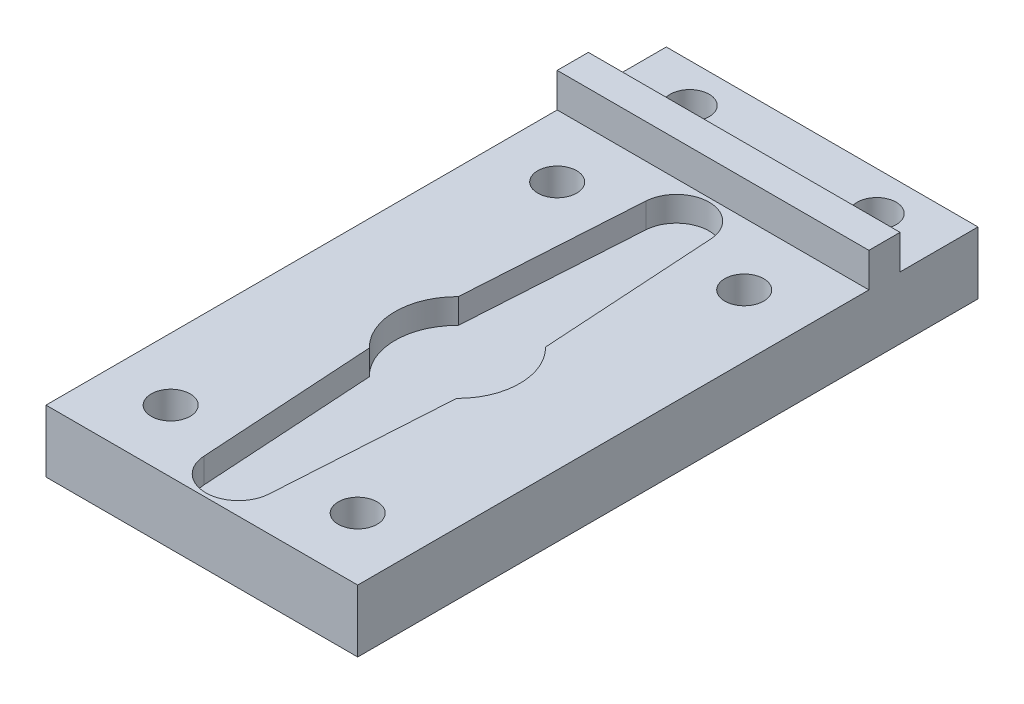
ISO-10303-21;
HEADER;
FILE_DESCRIPTION(('STEP AP214'),'2;1');
FILE_NAME('part.step','',(''),(''),'','','');
FILE_SCHEMA(('AUTOMOTIVE_DESIGN { 1 0 10303 214 1 1 1 1 }'));
ENDSEC;
DATA;
#1=APPLICATION_CONTEXT('core data for automotive mechanical design processes');
#2=APPLICATION_PROTOCOL_DEFINITION('international standard','automotive_design',2000,#1);
#3=PRODUCT_CONTEXT('',#1,'mechanical');
#4=PRODUCT('Part','Part','',(#3));
#5=PRODUCT_RELATED_PRODUCT_CATEGORY('part','',(#4));
#6=PRODUCT_DEFINITION_FORMATION('','',#4);
#7=PRODUCT_DEFINITION_CONTEXT('part definition',#1,'design');
#8=PRODUCT_DEFINITION('design','',#6,#7);
#9=PRODUCT_DEFINITION_SHAPE('','',#8);
#10=(LENGTH_UNIT() NAMED_UNIT(*) SI_UNIT(.MILLI.,.METRE.));
#11=(NAMED_UNIT(*) PLANE_ANGLE_UNIT() SI_UNIT($,.RADIAN.));
#12=(NAMED_UNIT(*) SI_UNIT($,.STERADIAN.) SOLID_ANGLE_UNIT());
#13=UNCERTAINTY_MEASURE_WITH_UNIT(LENGTH_MEASURE(1.E-05),#10,'distance_accuracy_value','');
#14=(GEOMETRIC_REPRESENTATION_CONTEXT(3) GLOBAL_UNCERTAINTY_ASSIGNED_CONTEXT((#13)) GLOBAL_UNIT_ASSIGNED_CONTEXT((#10,
#11,#12)) REPRESENTATION_CONTEXT('',''));
#15=CARTESIAN_POINT('',(0.,0.,0.));
#16=DIRECTION('',(0.,0.,1.));
#17=DIRECTION('',(1.,0.,0.));
#18=AXIS2_PLACEMENT_3D('',#15,#16,#17);
#19=CARTESIAN_POINT('',(16.,6.2,-4.5));
#20=DIRECTION('',(0.,-1.,0.));
#21=DIRECTION('',(0.,0.,-1.));
#22=AXIS2_PLACEMENT_3D('',#19,#20,#21);
#23=CYLINDRICAL_SURFACE('',#22,1.25);
#24=CARTESIAN_POINT('',(16.,4.,-4.5));
#25=DIRECTION('',(0.,-1.,0.));
#26=DIRECTION('',(1.,0.,0.));
#27=AXIS2_PLACEMENT_3D('',#24,#25,#26);
#28=CIRCLE('',#27,1.25);
#29=CARTESIAN_POINT('',(17.25,4.,-4.5));
#30=VERTEX_POINT('',#29);
#31=EDGE_CURVE('E381',#30,#30,#28,.T.);
#32=ORIENTED_EDGE('',*,*,#31,.F.);
#33=EDGE_LOOP('',(#32));
#34=FACE_BOUND('',#33,.T.);
#35=CARTESIAN_POINT('',(16.,1.5,-4.5));
#36=DIRECTION('',(0.,-1.,0.));
#37=DIRECTION('',(0.,0.,-1.));
#38=AXIS2_PLACEMENT_3D('',#35,#36,#37);
#39=CIRCLE('',#38,1.25);
#40=CARTESIAN_POINT('',(16.,1.5,-5.75));
#41=VERTEX_POINT('',#40);
#42=EDGE_CURVE('E98',#41,#41,#39,.F.);
#43=ORIENTED_EDGE('',*,*,#42,.F.);
#44=EDGE_LOOP('',(#43));
#45=FACE_BOUND('',#44,.T.);
#46=ADVANCED_FACE('F94',(#34,#45),#23,.F.);
#47=CARTESIAN_POINT('',(4.,6.2,-4.5));
#48=DIRECTION('',(0.,-1.,0.));
#49=DIRECTION('',(0.,0.,-1.));
#50=AXIS2_PLACEMENT_3D('',#47,#48,#49);
#51=CYLINDRICAL_SURFACE('',#50,1.25);
#52=CARTESIAN_POINT('',(4.,4.,-4.5));
#53=DIRECTION('',(0.,-1.,0.));
#54=DIRECTION('',(1.,0.,0.));
#55=AXIS2_PLACEMENT_3D('',#52,#53,#54);
#56=CIRCLE('',#55,1.25);
#57=CARTESIAN_POINT('',(5.25,4.,-4.5));
#58=VERTEX_POINT('',#57);
#59=EDGE_CURVE('E384',#58,#58,#56,.T.);
#60=ORIENTED_EDGE('',*,*,#59,.F.);
#61=EDGE_LOOP('',(#60));
#62=FACE_BOUND('',#61,.T.);
#63=CARTESIAN_POINT('',(4.,1.5,-4.5));
#64=DIRECTION('',(0.,-1.,0.));
#65=DIRECTION('',(0.,0.,-1.));
#66=AXIS2_PLACEMENT_3D('',#63,#64,#65);
#67=CIRCLE('',#66,1.25);
#68=CARTESIAN_POINT('',(4.,1.5,-5.75));
#69=VERTEX_POINT('',#68);
#70=EDGE_CURVE('E386',#69,#69,#67,.F.);
#71=ORIENTED_EDGE('',*,*,#70,.F.);
#72=EDGE_LOOP('',(#71));
#73=FACE_BOUND('',#72,.T.);
#74=ADVANCED_FACE('F454',(#62,#73),#51,.F.);
#75=CARTESIAN_POINT('',(0.,0.,-2.));
#76=DIRECTION('',(0.,0.,1.));
#77=DIRECTION('',(1.,0.,0.));
#78=AXIS2_PLACEMENT_3D('',#75,#76,#77);
#79=PLANE('',#78);
#80=DIRECTION('',(1.,0.,0.));
#81=VECTOR('',#80,1.);
#82=CARTESIAN_POINT('',(0.,4.,-2.));
#83=LINE('',#82,#81);
#84=CARTESIAN_POINT('',(0.,4.,-2.));
#85=VERTEX_POINT('',#84);
#86=CARTESIAN_POINT('',(20.,4.,-2.));
#87=VERTEX_POINT('',#86);
#88=EDGE_CURVE('E111',#85,#87,#83,.T.);
#89=ORIENTED_EDGE('',*,*,#88,.F.);
#90=DIRECTION('',(0.,-1.,0.));
#91=VECTOR('',#90,1.);
#92=CARTESIAN_POINT('',(0.,6.2,-2.));
#93=LINE('',#92,#91);
#94=CARTESIAN_POINT('',(0.,6.2,-2.));
#95=VERTEX_POINT('',#94);
#96=EDGE_CURVE('E244',#95,#85,#93,.T.);
#97=ORIENTED_EDGE('',*,*,#96,.F.);
#98=DIRECTION('',(-1.,0.,0.));
#99=VECTOR('',#98,1.);
#100=CARTESIAN_POINT('',(20.,6.2,-2.));
#101=LINE('',#100,#99);
#102=CARTESIAN_POINT('',(20.,6.2,-2.));
#103=VERTEX_POINT('',#102);
#104=EDGE_CURVE('E241',#103,#95,#101,.T.);
#105=ORIENTED_EDGE('',*,*,#104,.F.);
#106=DIRECTION('',(0.,-1.,0.));
#107=VECTOR('',#106,1.);
#108=CARTESIAN_POINT('',(20.,6.2,-2.));
#109=LINE('',#108,#107);
#110=EDGE_CURVE('E247',#103,#87,#109,.T.);
#111=ORIENTED_EDGE('',*,*,#110,.T.);
#112=EDGE_LOOP('',(#89,#97,#105,#111));
#113=FACE_BOUND('',#112,.T.);
#114=ADVANCED_FACE('F413',(#113),#79,.F.);
#115=CARTESIAN_POINT('',(0.,4.,0.));
#116=DIRECTION('',(1.,0.,0.));
#117=DIRECTION('',(0.,0.,-1.));
#118=AXIS2_PLACEMENT_3D('',#115,#116,#117);
#119=PLANE('',#118);
#120=DIRECTION('',(0.,0.,1.));
#121=VECTOR('',#120,1.);
#122=CARTESIAN_POINT('',(0.,0.,0.));
#123=LINE('',#122,#121);
#124=CARTESIAN_POINT('',(0.,0.,-7.));
#125=VERTEX_POINT('',#124);
#126=CARTESIAN_POINT('',(0.,0.,32.7999999999999));
#127=VERTEX_POINT('',#126);
#128=EDGE_CURVE('E358',#125,#127,#123,.T.);
#129=ORIENTED_EDGE('',*,*,#128,.T.);
#130=DIRECTION('',(0.,-1.,0.));
#131=VECTOR('',#130,1.);
#132=CARTESIAN_POINT('',(0.,4.,32.7999999999999));
#133=LINE('',#132,#131);
#134=CARTESIAN_POINT('',(0.,4.,32.7999999999999));
#135=VERTEX_POINT('',#134);
#136=EDGE_CURVE('E12',#135,#127,#133,.T.);
#137=ORIENTED_EDGE('',*,*,#136,.F.);
#138=DIRECTION('',(0.,0.,1.));
#139=VECTOR('',#138,1.);
#140=CARTESIAN_POINT('',(0.,4.,0.));
#141=LINE('',#140,#139);
#142=CARTESIAN_POINT('',(0.,4.,0.));
#143=VERTEX_POINT('',#142);
#144=EDGE_CURVE('E363',#143,#135,#141,.T.);
#145=ORIENTED_EDGE('',*,*,#144,.F.);
#146=DIRECTION('',(0.,-1.,0.));
#147=VECTOR('',#146,1.);
#148=CARTESIAN_POINT('',(0.,6.2,0.));
#149=LINE('',#148,#147);
#150=CARTESIAN_POINT('',(0.,6.2,0.));
#151=VERTEX_POINT('',#150);
#152=EDGE_CURVE('E236',#151,#143,#149,.T.);
#153=ORIENTED_EDGE('',*,*,#152,.F.);
#154=DIRECTION('',(0.,0.,1.));
#155=VECTOR('',#154,1.);
#156=CARTESIAN_POINT('',(0.,6.2,-2.));
#157=LINE('',#156,#155);
#158=EDGE_CURVE('E248',#95,#151,#157,.T.);
#159=ORIENTED_EDGE('',*,*,#158,.F.);
#160=ORIENTED_EDGE('',*,*,#96,.T.);
#161=DIRECTION('',(0.,0.,1.));
#162=VECTOR('',#161,1.);
#163=CARTESIAN_POINT('',(0.,4.,-7.));
#164=LINE('',#163,#162);
#165=CARTESIAN_POINT('',(0.,4.,-7.));
#166=VERTEX_POINT('',#165);
#167=EDGE_CURVE('E233',#166,#85,#164,.T.);
#168=ORIENTED_EDGE('',*,*,#167,.F.);
#169=DIRECTION('',(0.,1.,0.));
#170=VECTOR('',#169,1.);
#171=CARTESIAN_POINT('',(0.,0.,-7.));
#172=LINE('',#171,#170);
#173=EDGE_CURVE('E226',#125,#166,#172,.T.);
#174=ORIENTED_EDGE('',*,*,#173,.F.);
#175=EDGE_LOOP('',(#129,#137,#145,#153,#159,#160,#168,#174));
#176=FACE_BOUND('',#175,.T.);
#177=ADVANCED_FACE('F409',(#176),#119,.F.);
#178=CARTESIAN_POINT('',(0.,4.,32.7999999999999));
#179=DIRECTION('',(0.,0.,-1.));
#180=DIRECTION('',(-1.,0.,0.));
#181=AXIS2_PLACEMENT_3D('',#178,#179,#180);
#182=PLANE('',#181);
#183=DIRECTION('',(1.,0.,0.));
#184=VECTOR('',#183,1.);
#185=CARTESIAN_POINT('',(0.,0.,32.7999999999999));
#186=LINE('',#185,#184);
#187=CARTESIAN_POINT('',(20.,0.,32.7999999999999));
#188=VERTEX_POINT('',#187);
#189=EDGE_CURVE('E366',#127,#188,#186,.T.);
#190=ORIENTED_EDGE('',*,*,#189,.T.);
#191=DIRECTION('',(0.,-1.,0.));
#192=VECTOR('',#191,1.);
#193=CARTESIAN_POINT('',(20.,4.,32.7999999999999));
#194=LINE('',#193,#192);
#195=CARTESIAN_POINT('',(20.,4.,32.7999999999999));
#196=VERTEX_POINT('',#195);
#197=EDGE_CURVE('E103',#196,#188,#194,.T.);
#198=ORIENTED_EDGE('',*,*,#197,.F.);
#199=DIRECTION('',(1.,0.,0.));
#200=VECTOR('',#199,1.);
#201=CARTESIAN_POINT('',(0.,4.,32.7999999999999));
#202=LINE('',#201,#200);
#203=EDGE_CURVE('E361',#135,#196,#202,.T.);
#204=ORIENTED_EDGE('',*,*,#203,.F.);
#205=ORIENTED_EDGE('',*,*,#136,.T.);
#206=EDGE_LOOP('',(#190,#198,#204,#205));
#207=FACE_BOUND('',#206,.T.);
#208=ADVANCED_FACE('F427',(#207),#182,.F.);
#209=CARTESIAN_POINT('',(20.,4.,0.));
#210=DIRECTION('',(1.,0.,0.));
#211=DIRECTION('',(0.,0.,-1.));
#212=AXIS2_PLACEMENT_3D('',#209,#210,#211);
#213=PLANE('',#212);
#214=DIRECTION('',(0.,0.,1.));
#215=VECTOR('',#214,1.);
#216=CARTESIAN_POINT('',(20.,0.,0.));
#217=LINE('',#216,#215);
#218=CARTESIAN_POINT('',(20.,0.,-7.));
#219=VERTEX_POINT('',#218);
#220=EDGE_CURVE('E216',#219,#188,#217,.T.);
#221=ORIENTED_EDGE('',*,*,#220,.F.);
#222=DIRECTION('',(0.,-1.,0.));
#223=VECTOR('',#222,1.);
#224=CARTESIAN_POINT('',(20.,0.,-7.));
#225=LINE('',#224,#223);
#226=CARTESIAN_POINT('',(20.,4.,-7.));
#227=VERTEX_POINT('',#226);
#228=EDGE_CURVE('E210',#227,#219,#225,.T.);
#229=ORIENTED_EDGE('',*,*,#228,.F.);
#230=DIRECTION('',(0.,0.,1.));
#231=VECTOR('',#230,1.);
#232=CARTESIAN_POINT('',(20.,4.,-7.));
#233=LINE('',#232,#231);
#234=EDGE_CURVE('E214',#227,#87,#233,.T.);
#235=ORIENTED_EDGE('',*,*,#234,.T.);
#236=ORIENTED_EDGE('',*,*,#110,.F.);
#237=DIRECTION('',(0.,0.,1.));
#238=VECTOR('',#237,1.);
#239=CARTESIAN_POINT('',(20.,6.2,-2.));
#240=LINE('',#239,#238);
#241=CARTESIAN_POINT('',(20.,6.2,0.));
#242=VERTEX_POINT('',#241);
#243=EDGE_CURVE('E254',#103,#242,#240,.T.);
#244=ORIENTED_EDGE('',*,*,#243,.T.);
#245=DIRECTION('',(0.,-1.,0.));
#246=VECTOR('',#245,1.);
#247=CARTESIAN_POINT('',(20.,6.2,0.));
#248=LINE('',#247,#246);
#249=CARTESIAN_POINT('',(20.,4.,0.));
#250=VERTEX_POINT('',#249);
#251=EDGE_CURVE('E245',#242,#250,#248,.T.);
#252=ORIENTED_EDGE('',*,*,#251,.T.);
#253=DIRECTION('',(0.,0.,1.));
#254=VECTOR('',#253,1.);
#255=CARTESIAN_POINT('',(20.,4.,0.));
#256=LINE('',#255,#254);
#257=EDGE_CURVE('E357',#250,#196,#256,.T.);
#258=ORIENTED_EDGE('',*,*,#257,.T.);
#259=ORIENTED_EDGE('',*,*,#197,.T.);
#260=EDGE_LOOP('',(#221,#229,#235,#236,#244,#252,#258,#259));
#261=FACE_BOUND('',#260,.T.);
#262=ADVANCED_FACE('F96',(#261),#213,.T.);
#263=CARTESIAN_POINT('',(0.,4.,0.));
#264=DIRECTION('',(0.,-1.,0.));
#265=DIRECTION('',(0.,0.,-1.));
#266=AXIS2_PLACEMENT_3D('',#263,#264,#265);
#267=PLANE('',#266);
#268=CARTESIAN_POINT('',(4.,4.,4.));
#269=DIRECTION('',(0.,-1.,0.));
#270=DIRECTION('',(0.,0.,-1.));
#271=AXIS2_PLACEMENT_3D('',#268,#269,#270);
#272=CIRCLE('',#271,1.25);
#273=CARTESIAN_POINT('',(4.,4.,2.75));
#274=VERTEX_POINT('',#273);
#275=EDGE_CURVE('E256',#274,#274,#272,.T.);
#276=ORIENTED_EDGE('',*,*,#275,.T.);
#277=EDGE_LOOP('',(#276));
#278=FACE_BOUND('',#277,.T.);
#279=CARTESIAN_POINT('',(16.,4.,4.));
#280=DIRECTION('',(0.,-1.,0.));
#281=DIRECTION('',(0.,0.,-1.));
#282=AXIS2_PLACEMENT_3D('',#279,#280,#281);
#283=CIRCLE('',#282,1.25);
#284=CARTESIAN_POINT('',(16.,4.,2.75));
#285=VERTEX_POINT('',#284);
#286=EDGE_CURVE('E262',#285,#285,#283,.T.);
#287=ORIENTED_EDGE('',*,*,#286,.T.);
#288=EDGE_LOOP('',(#287));
#289=FACE_BOUND('',#288,.T.);
#290=CARTESIAN_POINT('',(16.,4.,28.7999999999999));
#291=DIRECTION('',(0.,-1.,0.));
#292=DIRECTION('',(0.,0.,-1.));
#293=AXIS2_PLACEMENT_3D('',#290,#291,#292);
#294=CIRCLE('',#293,1.25);
#295=CARTESIAN_POINT('',(16.,4.,27.5499999999999));
#296=VERTEX_POINT('',#295);
#297=EDGE_CURVE('E258',#296,#296,#294,.T.);
#298=ORIENTED_EDGE('',*,*,#297,.T.);
#299=EDGE_LOOP('',(#298));
#300=FACE_BOUND('',#299,.T.);
#301=CARTESIAN_POINT('',(4.,4.,28.7999999999999));
#302=DIRECTION('',(0.,-1.,0.));
#303=DIRECTION('',(0.,0.,-1.));
#304=AXIS2_PLACEMENT_3D('',#301,#302,#303);
#305=CIRCLE('',#304,1.25);
#306=CARTESIAN_POINT('',(4.,4.,27.5499999999999));
#307=VERTEX_POINT('',#306);
#308=EDGE_CURVE('E261',#307,#307,#305,.T.);
#309=ORIENTED_EDGE('',*,*,#308,.T.);
#310=EDGE_LOOP('',(#309));
#311=FACE_BOUND('',#310,.T.);
#312=DIRECTION('',(-0.0620545983388397,0.,-0.998072756278321));
#313=VECTOR('',#312,1.);
#314=CARTESIAN_POINT('',(5.97961860815221,4.,-0.371779340347872));
#315=LINE('',#314,#313);
#316=CARTESIAN_POINT('',(7.90404721181756,4.,30.5803146565114));
#317=VERTEX_POINT('',#316);
#318=CARTESIAN_POINT('',(7.2,4.,19.2565713714146));
#319=VERTEX_POINT('',#318);
#320=EDGE_CURVE('E321',#317,#319,#315,.T.);
#321=ORIENTED_EDGE('',*,*,#320,.T.);
#322=CARTESIAN_POINT('',(10.,4.,16.4));
#323=DIRECTION('',(0.,1.,0.));
#324=DIRECTION('',(0.,0.,1.));
#325=AXIS2_PLACEMENT_3D('',#322,#323,#324);
#326=CIRCLE('',#325,3.99999999999822);
#327=CARTESIAN_POINT('',(7.2,4.,13.5434286285853));
#328=VERTEX_POINT('',#327);
#329=EDGE_CURVE('E348',#328,#319,#326,.T.);
#330=ORIENTED_EDGE('',*,*,#329,.F.);
#331=DIRECTION('',(-0.0620545983388394,0.,0.998072756278321));
#332=VECTOR('',#331,1.);
#333=CARTESIAN_POINT('',(8.01108673947651,4.,0.498084700487696));
#334=LINE('',#333,#332);
#335=CARTESIAN_POINT('',(7.90404721181755,4.,2.21968534348852));
#336=VERTEX_POINT('',#335);
#337=EDGE_CURVE('E304',#336,#328,#334,.T.);
#338=ORIENTED_EDGE('',*,*,#337,.F.);
#339=CARTESIAN_POINT('',(10.,4.,2.34999999999995));
#340=DIRECTION('',(0.,1.,0.));
#341=DIRECTION('',(0.,0.,1.));
#342=AXIS2_PLACEMENT_3D('',#339,#340,#341);
#343=CIRCLE('',#342,2.09999999999797);
#344=CARTESIAN_POINT('',(12.0959527881824,4.,2.21968534348852));
#345=VERTEX_POINT('',#344);
#346=EDGE_CURVE('E293',#345,#336,#343,.T.);
#347=ORIENTED_EDGE('',*,*,#346,.F.);
#348=DIRECTION('',(0.0620545983388394,0.,0.998072756278321));
#349=VECTOR('',#348,1.);
#350=CARTESIAN_POINT('',(11.9118977970236,4.,-0.740615379588095));
#351=LINE('',#350,#349);
#352=CARTESIAN_POINT('',(12.8,4.,13.5434286285853));
#353=VERTEX_POINT('',#352);
#354=EDGE_CURVE('E300',#345,#353,#351,.T.);
#355=ORIENTED_EDGE('',*,*,#354,.T.);
#356=CARTESIAN_POINT('',(12.8,4.,19.2565713714146));
#357=VERTEX_POINT('',#356);
#358=EDGE_CURVE('E345',#357,#353,#326,.T.);
#359=ORIENTED_EDGE('',*,*,#358,.F.);
#360=DIRECTION('',(-0.0620545983388397,0.,0.998072756278321));
#361=VECTOR('',#360,1.);
#362=CARTESIAN_POINT('',(13.9433659283479,4.,0.866920739727925));
#363=LINE('',#362,#361);
#364=CARTESIAN_POINT('',(12.0959527881824,4.,30.5803146565114));
#365=VERTEX_POINT('',#364);
#366=EDGE_CURVE('E119',#357,#365,#363,.T.);
#367=ORIENTED_EDGE('',*,*,#366,.T.);
#368=CARTESIAN_POINT('',(10.,4.,30.45));
#369=DIRECTION('',(0.,1.,0.));
#370=DIRECTION('',(0.,0.,1.));
#371=AXIS2_PLACEMENT_3D('',#368,#369,#370);
#372=CIRCLE('',#371,2.09999999999797);
#373=EDGE_CURVE('E338',#317,#365,#372,.T.);
#374=ORIENTED_EDGE('',*,*,#373,.F.);
#375=EDGE_LOOP('',(#321,#330,#338,#347,#355,#359,#367,#374));
#376=FACE_BOUND('',#375,.T.);
#377=DIRECTION('',(1.,0.,0.));
#378=VECTOR('',#377,1.);
#379=CARTESIAN_POINT('',(0.,4.,0.));
#380=LINE('',#379,#378);
#381=EDGE_CURVE('E354',#143,#250,#380,.T.);
#382=ORIENTED_EDGE('',*,*,#381,.F.);
#383=ORIENTED_EDGE('',*,*,#144,.T.);
#384=ORIENTED_EDGE('',*,*,#203,.T.);
#385=ORIENTED_EDGE('',*,*,#257,.F.);
#386=EDGE_LOOP('',(#382,#383,#384,#385));
#387=FACE_BOUND('',#386,.T.);
#388=ADVANCED_FACE('F422',(#278,#289,#300,#311,#376,#387),#267,.F.);
#389=CARTESIAN_POINT('',(0.,0.,0.));
#390=DIRECTION('',(0.,-1.,0.));
#391=DIRECTION('',(0.,0.,-1.));
#392=AXIS2_PLACEMENT_3D('',#389,#390,#391);
#393=PLANE('',#392);
#394=CARTESIAN_POINT('',(4.,0.,-4.5));
#395=DIRECTION('',(0.,-1.,0.));
#396=DIRECTION('',(0.,0.,-1.));
#397=AXIS2_PLACEMENT_3D('',#394,#395,#396);
#398=CIRCLE('',#397,2.);
#399=CARTESIAN_POINT('',(4.,0.,-6.5));
#400=VERTEX_POINT('',#399);
#401=EDGE_CURVE('E393',#400,#400,#398,.T.);
#402=ORIENTED_EDGE('',*,*,#401,.F.);
#403=EDGE_LOOP('',(#402));
#404=FACE_BOUND('',#403,.T.);
#405=CARTESIAN_POINT('',(16.,0.,-4.5));
#406=DIRECTION('',(0.,-1.,0.));
#407=DIRECTION('',(0.,0.,-1.));
#408=AXIS2_PLACEMENT_3D('',#405,#406,#407);
#409=CIRCLE('',#408,2.);
#410=CARTESIAN_POINT('',(16.,0.,-6.5));
#411=VERTEX_POINT('',#410);
#412=EDGE_CURVE('E398',#411,#411,#409,.T.);
#413=ORIENTED_EDGE('',*,*,#412,.F.);
#414=EDGE_LOOP('',(#413));
#415=FACE_BOUND('',#414,.T.);
#416=CARTESIAN_POINT('',(16.,0.,28.7999999999999));
#417=DIRECTION('',(0.,-1.,0.));
#418=DIRECTION('',(0.,0.,-1.));
#419=AXIS2_PLACEMENT_3D('',#416,#417,#418);
#420=CIRCLE('',#419,2.00000000000001);
#421=CARTESIAN_POINT('',(16.,0.,26.7999999999999));
#422=VERTEX_POINT('',#421);
#423=EDGE_CURVE('E278',#422,#422,#420,.T.);
#424=ORIENTED_EDGE('',*,*,#423,.F.);
#425=EDGE_LOOP('',(#424));
#426=FACE_BOUND('',#425,.T.);
#427=CARTESIAN_POINT('',(4.,0.,4.));
#428=DIRECTION('',(0.,-1.,0.));
#429=DIRECTION('',(0.,0.,-1.));
#430=AXIS2_PLACEMENT_3D('',#427,#428,#429);
#431=CIRCLE('',#430,2.);
#432=CARTESIAN_POINT('',(4.,0.,2.));
#433=VERTEX_POINT('',#432);
#434=EDGE_CURVE('E285',#433,#433,#431,.T.);
#435=ORIENTED_EDGE('',*,*,#434,.F.);
#436=EDGE_LOOP('',(#435));
#437=FACE_BOUND('',#436,.T.);
#438=CARTESIAN_POINT('',(16.,0.,4.));
#439=DIRECTION('',(0.,-1.,0.));
#440=DIRECTION('',(0.,0.,-1.));
#441=AXIS2_PLACEMENT_3D('',#438,#439,#440);
#442=CIRCLE('',#441,2.);
#443=CARTESIAN_POINT('',(16.,0.,2.));
#444=VERTEX_POINT('',#443);
#445=EDGE_CURVE('E270',#444,#444,#442,.T.);
#446=ORIENTED_EDGE('',*,*,#445,.F.);
#447=EDGE_LOOP('',(#446));
#448=FACE_BOUND('',#447,.T.);
#449=CARTESIAN_POINT('',(4.,0.,28.7999999999999));
#450=DIRECTION('',(0.,-1.,0.));
#451=DIRECTION('',(0.,0.,-1.));
#452=AXIS2_PLACEMENT_3D('',#449,#450,#451);
#453=CIRCLE('',#452,2.);
#454=CARTESIAN_POINT('',(4.,0.,26.7999999999999));
#455=VERTEX_POINT('',#454);
#456=EDGE_CURVE('E281',#455,#455,#453,.T.);
#457=ORIENTED_EDGE('',*,*,#456,.F.);
#458=EDGE_LOOP('',(#457));
#459=FACE_BOUND('',#458,.T.);
#460=ORIENTED_EDGE('',*,*,#128,.F.);
#461=DIRECTION('',(-1.,0.,0.));
#462=VECTOR('',#461,1.);
#463=CARTESIAN_POINT('',(0.,0.,-7.));
#464=LINE('',#463,#462);
#465=EDGE_CURVE('E220',#219,#125,#464,.T.);
#466=ORIENTED_EDGE('',*,*,#465,.F.);
#467=ORIENTED_EDGE('',*,*,#220,.T.);
#468=ORIENTED_EDGE('',*,*,#189,.F.);
#469=EDGE_LOOP('',(#460,#466,#467,#468));
#470=FACE_BOUND('',#469,.T.);
#471=ADVANCED_FACE('F428',(#404,#415,#426,#437,#448,#459,#470),#393,.T.);
#472=CARTESIAN_POINT('',(11.9118977970236,2.4,-0.740615379588095));
#473=DIRECTION('',(-0.998072756278321,0.,0.0620545983388394));
#474=DIRECTION('',(0.0620545983388394,0.,0.998072756278321));
#475=AXIS2_PLACEMENT_3D('',#472,#473,#474);
#476=PLANE('',#475);
#477=ORIENTED_EDGE('',*,*,#354,.F.);
#478=DIRECTION('',(0.,1.,0.));
#479=VECTOR('',#478,1.);
#480=CARTESIAN_POINT('',(12.0959527881824,2.4,2.21968534348852));
#481=LINE('',#480,#479);
#482=CARTESIAN_POINT('',(12.0959527881824,2.4,2.21968534348852));
#483=VERTEX_POINT('',#482);
#484=EDGE_CURVE('E310',#483,#345,#481,.T.);
#485=ORIENTED_EDGE('',*,*,#484,.F.);
#486=DIRECTION('',(0.0620545983388394,0.,0.998072756278321));
#487=VECTOR('',#486,1.);
#488=CARTESIAN_POINT('',(11.9118977970236,2.4,-0.740615379588095));
#489=LINE('',#488,#487);
#490=CARTESIAN_POINT('',(12.8,2.4,13.5434286285853));
#491=VERTEX_POINT('',#490);
#492=EDGE_CURVE('E299',#483,#491,#489,.T.);
#493=ORIENTED_EDGE('',*,*,#492,.T.);
#494=DIRECTION('',(0.,1.,0.));
#495=VECTOR('',#494,1.);
#496=CARTESIAN_POINT('',(12.8,2.4,13.5434286285853));
#497=LINE('',#496,#495);
#498=EDGE_CURVE('E312',#491,#353,#497,.T.);
#499=ORIENTED_EDGE('',*,*,#498,.T.);
#500=EDGE_LOOP('',(#477,#485,#493,#499));
#501=FACE_BOUND('',#500,.T.);
#502=ADVANCED_FACE('F430',(#501),#476,.T.);
#503=CARTESIAN_POINT('',(8.01108673947651,2.4,0.498084700487696));
#504=DIRECTION('',(-0.998072756278321,0.,-0.0620545983388394));
#505=DIRECTION('',(-0.0620545983388394,0.,0.998072756278321));
#506=AXIS2_PLACEMENT_3D('',#503,#504,#505);
#507=PLANE('',#506);
#508=ORIENTED_EDGE('',*,*,#337,.T.);
#509=DIRECTION('',(0.,1.,0.));
#510=VECTOR('',#509,1.);
#511=CARTESIAN_POINT('',(7.2,2.4,13.5434286285853));
#512=LINE('',#511,#510);
#513=CARTESIAN_POINT('',(7.2,2.4,13.5434286285853));
#514=VERTEX_POINT('',#513);
#515=EDGE_CURVE('E314',#514,#328,#512,.T.);
#516=ORIENTED_EDGE('',*,*,#515,.F.);
#517=DIRECTION('',(-0.0620545983388394,0.,0.998072756278321));
#518=VECTOR('',#517,1.);
#519=CARTESIAN_POINT('',(8.01108673947651,2.4,0.498084700487696));
#520=LINE('',#519,#518);
#521=CARTESIAN_POINT('',(7.90404721181755,2.4,2.21968534348852));
#522=VERTEX_POINT('',#521);
#523=EDGE_CURVE('E296',#522,#514,#520,.T.);
#524=ORIENTED_EDGE('',*,*,#523,.F.);
#525=DIRECTION('',(0.,1.,0.));
#526=VECTOR('',#525,1.);
#527=CARTESIAN_POINT('',(7.90404721181755,2.4,2.21968534348852));
#528=LINE('',#527,#526);
#529=EDGE_CURVE('E303',#522,#336,#528,.T.);
#530=ORIENTED_EDGE('',*,*,#529,.T.);
#531=EDGE_LOOP('',(#508,#516,#524,#530));
#532=FACE_BOUND('',#531,.T.);
#533=ADVANCED_FACE('F439',(#532),#507,.F.);
#534=CARTESIAN_POINT('',(0.,2.4,0.));
#535=DIRECTION('',(0.,1.,0.));
#536=DIRECTION('',(0.,0.,1.));
#537=AXIS2_PLACEMENT_3D('',#534,#535,#536);
#538=PLANE('',#537);
#539=ORIENTED_EDGE('',*,*,#523,.T.);
#540=CARTESIAN_POINT('',(10.,2.4,16.4));
#541=DIRECTION('',(0.,1.,0.));
#542=DIRECTION('',(0.,0.,1.));
#543=AXIS2_PLACEMENT_3D('',#540,#541,#542);
#544=CIRCLE('',#543,3.99999999999822);
#545=CARTESIAN_POINT('',(7.2,2.4,19.2565713714146));
#546=VERTEX_POINT('',#545);
#547=EDGE_CURVE('E344',#514,#546,#544,.T.);
#548=ORIENTED_EDGE('',*,*,#547,.T.);
#549=DIRECTION('',(-0.0620545983388397,0.,-0.998072756278321));
#550=VECTOR('',#549,1.);
#551=CARTESIAN_POINT('',(5.97961860815221,2.4,-0.371779340347872));
#552=LINE('',#551,#550);
#553=CARTESIAN_POINT('',(7.90404721181756,2.4,30.5803146565114));
#554=VERTEX_POINT('',#553);
#555=EDGE_CURVE('E320',#554,#546,#552,.T.);
#556=ORIENTED_EDGE('',*,*,#555,.F.);
#557=CARTESIAN_POINT('',(10.,2.4,30.45));
#558=DIRECTION('',(0.,1.,0.));
#559=DIRECTION('',(0.,0.,1.));
#560=AXIS2_PLACEMENT_3D('',#557,#558,#559);
#561=CIRCLE('',#560,2.09999999999797);
#562=CARTESIAN_POINT('',(12.0959527881824,2.4,30.5803146565114));
#563=VERTEX_POINT('',#562);
#564=EDGE_CURVE('E326',#554,#563,#561,.T.);
#565=ORIENTED_EDGE('',*,*,#564,.T.);
#566=DIRECTION('',(-0.0620545983388397,0.,0.998072756278321));
#567=VECTOR('',#566,1.);
#568=CARTESIAN_POINT('',(13.9433659283479,2.4,0.866920739727925));
#569=LINE('',#568,#567);
#570=CARTESIAN_POINT('',(12.8,2.4,19.2565713714146));
#571=VERTEX_POINT('',#570);
#572=EDGE_CURVE('E317',#571,#563,#569,.T.);
#573=ORIENTED_EDGE('',*,*,#572,.F.);
#574=EDGE_CURVE('E341',#571,#491,#544,.T.);
#575=ORIENTED_EDGE('',*,*,#574,.T.);
#576=ORIENTED_EDGE('',*,*,#492,.F.);
#577=CARTESIAN_POINT('',(10.,2.4,2.34999999999995));
#578=DIRECTION('',(0.,1.,0.));
#579=DIRECTION('',(0.,0.,1.));
#580=AXIS2_PLACEMENT_3D('',#577,#578,#579);
#581=CIRCLE('',#580,2.09999999999797);
#582=EDGE_CURVE('E349',#483,#522,#581,.T.);
#583=ORIENTED_EDGE('',*,*,#582,.T.);
#584=EDGE_LOOP('',(#539,#548,#556,#565,#573,#575,#576,#583));
#585=FACE_BOUND('',#584,.T.);
#586=ADVANCED_FACE('F450',(#585),#538,.T.);
#587=CARTESIAN_POINT('',(10.,2.4,2.34999999999995));
#588=DIRECTION('',(0.,1.,0.));
#589=DIRECTION('',(0.,0.,1.));
#590=AXIS2_PLACEMENT_3D('',#587,#588,#589);
#591=CYLINDRICAL_SURFACE('',#590,2.09999999999797);
#592=ORIENTED_EDGE('',*,*,#484,.T.);
#593=ORIENTED_EDGE('',*,*,#346,.T.);
#594=ORIENTED_EDGE('',*,*,#529,.F.);
#595=ORIENTED_EDGE('',*,*,#582,.F.);
#596=EDGE_LOOP('',(#592,#593,#594,#595));
#597=FACE_BOUND('',#596,.T.);
#598=ADVANCED_FACE('F433',(#597),#591,.F.);
#599=CARTESIAN_POINT('',(10.,2.4,30.45));
#600=DIRECTION('',(0.,1.,0.));
#601=DIRECTION('',(0.,0.,1.));
#602=AXIS2_PLACEMENT_3D('',#599,#600,#601);
#603=CYLINDRICAL_SURFACE('',#602,2.09999999999797);
#604=DIRECTION('',(0.,1.,0.));
#605=VECTOR('',#604,1.);
#606=CARTESIAN_POINT('',(7.90404721181756,2.4,30.5803146565114));
#607=LINE('',#606,#605);
#608=EDGE_CURVE('E307',#554,#317,#607,.T.);
#609=ORIENTED_EDGE('',*,*,#608,.T.);
#610=ORIENTED_EDGE('',*,*,#373,.T.);
#611=DIRECTION('',(0.,1.,0.));
#612=VECTOR('',#611,1.);
#613=CARTESIAN_POINT('',(12.0959527881824,2.4,30.5803146565114));
#614=LINE('',#613,#612);
#615=EDGE_CURVE('E324',#563,#365,#614,.T.);
#616=ORIENTED_EDGE('',*,*,#615,.F.);
#617=ORIENTED_EDGE('',*,*,#564,.F.);
#618=EDGE_LOOP('',(#609,#610,#616,#617));
#619=FACE_BOUND('',#618,.T.);
#620=ADVANCED_FACE('F449',(#619),#603,.F.);
#621=CARTESIAN_POINT('',(13.9433659283479,2.4,0.866920739727925));
#622=DIRECTION('',(-0.998072756278321,0.,-0.0620545983388397));
#623=DIRECTION('',(-0.0620545983388397,0.,0.998072756278321));
#624=AXIS2_PLACEMENT_3D('',#621,#622,#623);
#625=PLANE('',#624);
#626=ORIENTED_EDGE('',*,*,#366,.F.);
#627=DIRECTION('',(0.,1.,0.));
#628=VECTOR('',#627,1.);
#629=CARTESIAN_POINT('',(12.8,2.4,19.2565713714146));
#630=LINE('',#629,#628);
#631=EDGE_CURVE('E333',#571,#357,#630,.T.);
#632=ORIENTED_EDGE('',*,*,#631,.F.);
#633=ORIENTED_EDGE('',*,*,#572,.T.);
#634=ORIENTED_EDGE('',*,*,#615,.T.);
#635=EDGE_LOOP('',(#626,#632,#633,#634));
#636=FACE_BOUND('',#635,.T.);
#637=ADVANCED_FACE('F537',(#636),#625,.T.);
#638=CARTESIAN_POINT('',(5.97961860815221,2.4,-0.371779340347872));
#639=DIRECTION('',(0.998072756278321,0.,-0.0620545983388397));
#640=DIRECTION('',(-0.0620545983388397,0.,-0.998072756278321));
#641=AXIS2_PLACEMENT_3D('',#638,#639,#640);
#642=PLANE('',#641);
#643=ORIENTED_EDGE('',*,*,#320,.F.);
#644=ORIENTED_EDGE('',*,*,#608,.F.);
#645=ORIENTED_EDGE('',*,*,#555,.T.);
#646=DIRECTION('',(0.,1.,0.));
#647=VECTOR('',#646,1.);
#648=CARTESIAN_POINT('',(7.2,2.4,19.2565713714146));
#649=LINE('',#648,#647);
#650=EDGE_CURVE('E330',#546,#319,#649,.T.);
#651=ORIENTED_EDGE('',*,*,#650,.T.);
#652=EDGE_LOOP('',(#643,#644,#645,#651));
#653=FACE_BOUND('',#652,.T.);
#654=ADVANCED_FACE('F533',(#653),#642,.T.);
#655=CARTESIAN_POINT('',(10.,2.4,16.4));
#656=DIRECTION('',(0.,1.,0.));
#657=DIRECTION('',(0.,0.,1.));
#658=AXIS2_PLACEMENT_3D('',#655,#656,#657);
#659=CYLINDRICAL_SURFACE('',#658,3.99999999999822);
#660=ORIENTED_EDGE('',*,*,#329,.T.);
#661=ORIENTED_EDGE('',*,*,#650,.F.);
#662=ORIENTED_EDGE('',*,*,#547,.F.);
#663=ORIENTED_EDGE('',*,*,#515,.T.);
#664=EDGE_LOOP('',(#660,#661,#662,#663));
#665=FACE_BOUND('',#664,.T.);
#666=ADVANCED_FACE('F536',(#665),#659,.F.);
#667=ORIENTED_EDGE('',*,*,#574,.F.);
#668=ORIENTED_EDGE('',*,*,#631,.T.);
#669=ORIENTED_EDGE('',*,*,#358,.T.);
#670=ORIENTED_EDGE('',*,*,#498,.F.);
#671=EDGE_LOOP('',(#667,#668,#669,#670));
#672=FACE_BOUND('',#671,.T.);
#673=ADVANCED_FACE('F525',(#672),#659,.F.);
#674=CARTESIAN_POINT('',(4.,1.5,28.7999999999999));
#675=DIRECTION('',(0.,-1.,0.));
#676=DIRECTION('',(0.,0.,-1.));
#677=AXIS2_PLACEMENT_3D('',#674,#675,#676);
#678=CYLINDRICAL_SURFACE('',#677,2.);
#679=CARTESIAN_POINT('',(4.,1.5,28.7999999999999));
#680=DIRECTION('',(0.,-1.,0.));
#681=DIRECTION('',(0.,0.,-1.));
#682=AXIS2_PLACEMENT_3D('',#679,#680,#681);
#683=CIRCLE('',#682,2.);
#684=CARTESIAN_POINT('',(4.,1.5,26.7999999999999));
#685=VERTEX_POINT('',#684);
#686=EDGE_CURVE('E290',#685,#685,#683,.T.);
#687=ORIENTED_EDGE('',*,*,#686,.F.);
#688=EDGE_LOOP('',(#687));
#689=FACE_BOUND('',#688,.T.);
#690=ORIENTED_EDGE('',*,*,#456,.T.);
#691=EDGE_LOOP('',(#690));
#692=FACE_BOUND('',#691,.T.);
#693=ADVANCED_FACE('F521',(#689,#692),#678,.F.);
#694=CARTESIAN_POINT('',(4.,1.5,28.7999999999999));
#695=DIRECTION('',(0.,-1.,0.));
#696=DIRECTION('',(0.,0.,-1.));
#697=AXIS2_PLACEMENT_3D('',#694,#695,#696);
#698=PLANE('',#697);
#699=CARTESIAN_POINT('',(4.,1.5,28.7999999999999));
#700=DIRECTION('',(0.,-1.,0.));
#701=DIRECTION('',(0.,0.,-1.));
#702=AXIS2_PLACEMENT_3D('',#699,#700,#701);
#703=CIRCLE('',#702,1.25);
#704=CARTESIAN_POINT('',(4.,1.5,27.5499999999999));
#705=VERTEX_POINT('',#704);
#706=EDGE_CURVE('E277',#705,#705,#703,.T.);
#707=ORIENTED_EDGE('',*,*,#706,.F.);
#708=EDGE_LOOP('',(#707));
#709=FACE_BOUND('',#708,.T.);
#710=ORIENTED_EDGE('',*,*,#686,.T.);
#711=EDGE_LOOP('',(#710));
#712=FACE_BOUND('',#711,.T.);
#713=ADVANCED_FACE('F499',(#709,#712),#698,.T.);
#714=CARTESIAN_POINT('',(16.,1.5,4.));
#715=DIRECTION('',(0.,-1.,0.));
#716=DIRECTION('',(0.,0.,-1.));
#717=AXIS2_PLACEMENT_3D('',#714,#715,#716);
#718=CYLINDRICAL_SURFACE('',#717,2.);
#719=CARTESIAN_POINT('',(16.,1.5,4.));
#720=DIRECTION('',(0.,-1.,0.));
#721=DIRECTION('',(0.,0.,-1.));
#722=AXIS2_PLACEMENT_3D('',#719,#720,#721);
#723=CIRCLE('',#722,2.);
#724=CARTESIAN_POINT('',(16.,1.5,2.));
#725=VERTEX_POINT('',#724);
#726=EDGE_CURVE('E274',#725,#725,#723,.T.);
#727=ORIENTED_EDGE('',*,*,#726,.F.);
#728=EDGE_LOOP('',(#727));
#729=FACE_BOUND('',#728,.T.);
#730=ORIENTED_EDGE('',*,*,#445,.T.);
#731=EDGE_LOOP('',(#730));
#732=FACE_BOUND('',#731,.T.);
#733=ADVANCED_FACE('F495',(#729,#732),#718,.F.);
#734=CARTESIAN_POINT('',(16.,1.5,4.));
#735=DIRECTION('',(0.,-1.,0.));
#736=DIRECTION('',(0.,0.,-1.));
#737=AXIS2_PLACEMENT_3D('',#734,#735,#736);
#738=PLANE('',#737);
#739=CARTESIAN_POINT('',(16.,1.5,4.));
#740=DIRECTION('',(0.,-1.,0.));
#741=DIRECTION('',(0.,0.,-1.));
#742=AXIS2_PLACEMENT_3D('',#739,#740,#741);
#743=CIRCLE('',#742,1.25);
#744=CARTESIAN_POINT('',(16.,1.5,2.75));
#745=VERTEX_POINT('',#744);
#746=EDGE_CURVE('E376',#745,#745,#743,.T.);
#747=ORIENTED_EDGE('',*,*,#746,.F.);
#748=EDGE_LOOP('',(#747));
#749=FACE_BOUND('',#748,.T.);
#750=ORIENTED_EDGE('',*,*,#726,.T.);
#751=EDGE_LOOP('',(#750));
#752=FACE_BOUND('',#751,.T.);
#753=ADVANCED_FACE('F498',(#749,#752),#738,.T.);
#754=CARTESIAN_POINT('',(4.,1.5,4.));
#755=DIRECTION('',(0.,-1.,0.));
#756=DIRECTION('',(0.,0.,-1.));
#757=AXIS2_PLACEMENT_3D('',#754,#755,#756);
#758=CYLINDRICAL_SURFACE('',#757,2.);
#759=CARTESIAN_POINT('',(4.,1.5,4.));
#760=DIRECTION('',(0.,-1.,0.));
#761=DIRECTION('',(0.,0.,-1.));
#762=AXIS2_PLACEMENT_3D('',#759,#760,#761);
#763=CIRCLE('',#762,2.);
#764=CARTESIAN_POINT('',(4.,1.5,2.));
#765=VERTEX_POINT('',#764);
#766=EDGE_CURVE('E273',#765,#765,#763,.T.);
#767=ORIENTED_EDGE('',*,*,#766,.F.);
#768=EDGE_LOOP('',(#767));
#769=FACE_BOUND('',#768,.T.);
#770=ORIENTED_EDGE('',*,*,#434,.T.);
#771=EDGE_LOOP('',(#770));
#772=FACE_BOUND('',#771,.T.);
#773=ADVANCED_FACE('F503',(#769,#772),#758,.F.);
#774=CARTESIAN_POINT('',(4.,1.5,4.));
#775=DIRECTION('',(0.,-1.,0.));
#776=DIRECTION('',(0.,0.,-1.));
#777=AXIS2_PLACEMENT_3D('',#774,#775,#776);
#778=PLANE('',#777);
#779=CARTESIAN_POINT('',(4.,1.5,4.));
#780=DIRECTION('',(0.,-1.,0.));
#781=DIRECTION('',(0.,0.,-1.));
#782=AXIS2_PLACEMENT_3D('',#779,#780,#781);
#783=CIRCLE('',#782,1.25);
#784=CARTESIAN_POINT('',(4.,1.5,2.75));
#785=VERTEX_POINT('',#784);
#786=EDGE_CURVE('E373',#785,#785,#783,.T.);
#787=ORIENTED_EDGE('',*,*,#786,.F.);
#788=EDGE_LOOP('',(#787));
#789=FACE_BOUND('',#788,.T.);
#790=ORIENTED_EDGE('',*,*,#766,.T.);
#791=EDGE_LOOP('',(#790));
#792=FACE_BOUND('',#791,.T.);
#793=ADVANCED_FACE('F508',(#789,#792),#778,.T.);
#794=CARTESIAN_POINT('',(16.,1.5,28.7999999999999));
#795=DIRECTION('',(0.,-1.,0.));
#796=DIRECTION('',(0.,0.,-1.));
#797=AXIS2_PLACEMENT_3D('',#794,#795,#796);
#798=CYLINDRICAL_SURFACE('',#797,2.00000000000001);
#799=CARTESIAN_POINT('',(16.,1.5,28.7999999999999));
#800=DIRECTION('',(0.,-1.,0.));
#801=DIRECTION('',(0.,0.,-1.));
#802=AXIS2_PLACEMENT_3D('',#799,#800,#801);
#803=CIRCLE('',#802,2.00000000000001);
#804=CARTESIAN_POINT('',(16.,1.5,26.7999999999999));
#805=VERTEX_POINT('',#804);
#806=EDGE_CURVE('E282',#805,#805,#803,.T.);
#807=ORIENTED_EDGE('',*,*,#806,.F.);
#808=EDGE_LOOP('',(#807));
#809=FACE_BOUND('',#808,.T.);
#810=ORIENTED_EDGE('',*,*,#423,.T.);
#811=EDGE_LOOP('',(#810));
#812=FACE_BOUND('',#811,.T.);
#813=ADVANCED_FACE('F505',(#809,#812),#798,.F.);
#814=CARTESIAN_POINT('',(16.,1.5,28.7999999999999));
#815=DIRECTION('',(0.,-1.,0.));
#816=DIRECTION('',(0.,0.,-1.));
#817=AXIS2_PLACEMENT_3D('',#814,#815,#816);
#818=PLANE('',#817);
#819=CARTESIAN_POINT('',(16.,1.5,28.7999999999999));
#820=DIRECTION('',(0.,-1.,0.));
#821=DIRECTION('',(0.,0.,-1.));
#822=AXIS2_PLACEMENT_3D('',#819,#820,#821);
#823=CIRCLE('',#822,1.25);
#824=CARTESIAN_POINT('',(16.,1.5,27.5499999999999));
#825=VERTEX_POINT('',#824);
#826=EDGE_CURVE('E269',#825,#825,#823,.T.);
#827=ORIENTED_EDGE('',*,*,#826,.F.);
#828=EDGE_LOOP('',(#827));
#829=FACE_BOUND('',#828,.T.);
#830=ORIENTED_EDGE('',*,*,#806,.T.);
#831=EDGE_LOOP('',(#830));
#832=FACE_BOUND('',#831,.T.);
#833=ADVANCED_FACE('F483',(#829,#832),#818,.T.);
#834=CARTESIAN_POINT('',(16.,4.,28.7999999999999));
#835=DIRECTION('',(0.,-1.,0.));
#836=DIRECTION('',(0.,0.,-1.));
#837=AXIS2_PLACEMENT_3D('',#834,#835,#836);
#838=CYLINDRICAL_SURFACE('',#837,1.25);
#839=ORIENTED_EDGE('',*,*,#826,.T.);
#840=EDGE_LOOP('',(#839));
#841=FACE_BOUND('',#840,.T.);
#842=ORIENTED_EDGE('',*,*,#297,.F.);
#843=EDGE_LOOP('',(#842));
#844=FACE_BOUND('',#843,.T.);
#845=ADVANCED_FACE('F479',(#841,#844),#838,.F.);
#846=CARTESIAN_POINT('',(4.,4.,4.));
#847=DIRECTION('',(0.,-1.,0.));
#848=DIRECTION('',(0.,0.,-1.));
#849=AXIS2_PLACEMENT_3D('',#846,#847,#848);
#850=CYLINDRICAL_SURFACE('',#849,1.25);
#851=ORIENTED_EDGE('',*,*,#786,.T.);
#852=EDGE_LOOP('',(#851));
#853=FACE_BOUND('',#852,.T.);
#854=ORIENTED_EDGE('',*,*,#275,.F.);
#855=EDGE_LOOP('',(#854));
#856=FACE_BOUND('',#855,.T.);
#857=ADVANCED_FACE('F482',(#853,#856),#850,.F.);
#858=CARTESIAN_POINT('',(16.,4.,4.));
#859=DIRECTION('',(0.,-1.,0.));
#860=DIRECTION('',(0.,0.,-1.));
#861=AXIS2_PLACEMENT_3D('',#858,#859,#860);
#862=CYLINDRICAL_SURFACE('',#861,1.25);
#863=ORIENTED_EDGE('',*,*,#746,.T.);
#864=EDGE_LOOP('',(#863));
#865=FACE_BOUND('',#864,.T.);
#866=ORIENTED_EDGE('',*,*,#286,.F.);
#867=EDGE_LOOP('',(#866));
#868=FACE_BOUND('',#867,.T.);
#869=ADVANCED_FACE('F485',(#865,#868),#862,.F.);
#870=CARTESIAN_POINT('',(4.,4.,28.7999999999999));
#871=DIRECTION('',(0.,-1.,0.));
#872=DIRECTION('',(0.,0.,-1.));
#873=AXIS2_PLACEMENT_3D('',#870,#871,#872);
#874=CYLINDRICAL_SURFACE('',#873,1.25);
#875=ORIENTED_EDGE('',*,*,#706,.T.);
#876=EDGE_LOOP('',(#875));
#877=FACE_BOUND('',#876,.T.);
#878=ORIENTED_EDGE('',*,*,#308,.F.);
#879=EDGE_LOOP('',(#878));
#880=FACE_BOUND('',#879,.T.);
#881=ADVANCED_FACE('F478',(#877,#880),#874,.F.);
#882=CARTESIAN_POINT('',(20.,6.2,-2.));
#883=DIRECTION('',(0.,1.,0.));
#884=DIRECTION('',(0.,0.,1.));
#885=AXIS2_PLACEMENT_3D('',#882,#883,#884);
#886=PLANE('',#885);
#887=DIRECTION('',(-1.,0.,0.));
#888=VECTOR('',#887,1.);
#889=CARTESIAN_POINT('',(20.,6.2,0.));
#890=LINE('',#889,#888);
#891=EDGE_CURVE('E232',#242,#151,#890,.T.);
#892=ORIENTED_EDGE('',*,*,#891,.F.);
#893=ORIENTED_EDGE('',*,*,#243,.F.);
#894=ORIENTED_EDGE('',*,*,#104,.T.);
#895=ORIENTED_EDGE('',*,*,#158,.T.);
#896=EDGE_LOOP('',(#892,#893,#894,#895));
#897=FACE_BOUND('',#896,.T.);
#898=ADVANCED_FACE('F416',(#897),#886,.T.);
#899=CARTESIAN_POINT('',(0.,0.,0.));
#900=DIRECTION('',(0.,0.,1.));
#901=DIRECTION('',(1.,0.,0.));
#902=AXIS2_PLACEMENT_3D('',#899,#900,#901);
#903=PLANE('',#902);
#904=ORIENTED_EDGE('',*,*,#152,.T.);
#905=ORIENTED_EDGE('',*,*,#381,.T.);
#906=ORIENTED_EDGE('',*,*,#251,.F.);
#907=ORIENTED_EDGE('',*,*,#891,.T.);
#908=EDGE_LOOP('',(#904,#905,#906,#907));
#909=FACE_BOUND('',#908,.T.);
#910=ADVANCED_FACE('F419',(#909),#903,.T.);
#911=CARTESIAN_POINT('',(0.,4.,-7.));
#912=DIRECTION('',(0.,-1.,0.));
#913=DIRECTION('',(1.,0.,0.));
#914=AXIS2_PLACEMENT_3D('',#911,#912,#913);
#915=PLANE('',#914);
#916=ORIENTED_EDGE('',*,*,#59,.T.);
#917=EDGE_LOOP('',(#916));
#918=FACE_BOUND('',#917,.T.);
#919=ORIENTED_EDGE('',*,*,#31,.T.);
#920=EDGE_LOOP('',(#919));
#921=FACE_BOUND('',#920,.T.);
#922=ORIENTED_EDGE('',*,*,#88,.T.);
#923=ORIENTED_EDGE('',*,*,#234,.F.);
#924=DIRECTION('',(1.,0.,0.));
#925=VECTOR('',#924,1.);
#926=CARTESIAN_POINT('',(0.,4.,-7.));
#927=LINE('',#926,#925);
#928=EDGE_CURVE('E221',#166,#227,#927,.T.);
#929=ORIENTED_EDGE('',*,*,#928,.F.);
#930=ORIENTED_EDGE('',*,*,#167,.T.);
#931=EDGE_LOOP('',(#922,#923,#929,#930));
#932=FACE_BOUND('',#931,.T.);
#933=ADVANCED_FACE('F231',(#918,#921,#932),#915,.F.);
#934=CARTESIAN_POINT('',(0.,0.,-7.));
#935=DIRECTION('',(0.,0.,-1.));
#936=DIRECTION('',(-1.,0.,0.));
#937=AXIS2_PLACEMENT_3D('',#934,#935,#936);
#938=PLANE('',#937);
#939=ORIENTED_EDGE('',*,*,#928,.T.);
#940=ORIENTED_EDGE('',*,*,#228,.T.);
#941=ORIENTED_EDGE('',*,*,#465,.T.);
#942=ORIENTED_EDGE('',*,*,#173,.T.);
#943=EDGE_LOOP('',(#939,#940,#941,#942));
#944=FACE_BOUND('',#943,.T.);
#945=ADVANCED_FACE('F224',(#944),#938,.T.);
#946=CARTESIAN_POINT('',(4.,1.5,-4.5));
#947=DIRECTION('',(0.,-1.,0.));
#948=DIRECTION('',(0.,0.,-1.));
#949=AXIS2_PLACEMENT_3D('',#946,#947,#948);
#950=PLANE('',#949);
#951=CARTESIAN_POINT('',(4.,1.5,-4.5));
#952=DIRECTION('',(0.,-1.,0.));
#953=DIRECTION('',(0.,0.,-1.));
#954=AXIS2_PLACEMENT_3D('',#951,#952,#953);
#955=CIRCLE('',#954,2.);
#956=CARTESIAN_POINT('',(4.,1.5,-6.5));
#957=VERTEX_POINT('',#956);
#958=EDGE_CURVE('E388',#957,#957,#955,.T.);
#959=ORIENTED_EDGE('',*,*,#958,.T.);
#960=EDGE_LOOP('',(#959));
#961=FACE_BOUND('',#960,.T.);
#962=ORIENTED_EDGE('',*,*,#70,.T.);
#963=EDGE_LOOP('',(#962));
#964=FACE_BOUND('',#963,.T.);
#965=ADVANCED_FACE('F468',(#961,#964),#950,.T.);
#966=CARTESIAN_POINT('',(4.,1.5,-4.5));
#967=DIRECTION('',(0.,-1.,0.));
#968=DIRECTION('',(0.,0.,-1.));
#969=AXIS2_PLACEMENT_3D('',#966,#967,#968);
#970=CYLINDRICAL_SURFACE('',#969,2.);
#971=ORIENTED_EDGE('',*,*,#958,.F.);
#972=EDGE_LOOP('',(#971));
#973=FACE_BOUND('',#972,.T.);
#974=ORIENTED_EDGE('',*,*,#401,.T.);
#975=EDGE_LOOP('',(#974));
#976=FACE_BOUND('',#975,.T.);
#977=ADVANCED_FACE('F783',(#973,#976),#970,.F.);
#978=CARTESIAN_POINT('',(16.,1.5,-4.5));
#979=DIRECTION('',(0.,-1.,0.));
#980=DIRECTION('',(0.,0.,-1.));
#981=AXIS2_PLACEMENT_3D('',#978,#979,#980);
#982=PLANE('',#981);
#983=CARTESIAN_POINT('',(16.,1.5,-4.5));
#984=DIRECTION('',(0.,-1.,0.));
#985=DIRECTION('',(0.,0.,-1.));
#986=AXIS2_PLACEMENT_3D('',#983,#984,#985);
#987=CIRCLE('',#986,2.);
#988=CARTESIAN_POINT('',(16.,1.5,-6.5));
#989=VERTEX_POINT('',#988);
#990=EDGE_CURVE('E403',#989,#989,#987,.T.);
#991=ORIENTED_EDGE('',*,*,#990,.T.);
#992=EDGE_LOOP('',(#991));
#993=FACE_BOUND('',#992,.T.);
#994=ORIENTED_EDGE('',*,*,#42,.T.);
#995=EDGE_LOOP('',(#994));
#996=FACE_BOUND('',#995,.T.);
#997=ADVANCED_FACE('F791',(#993,#996),#982,.T.);
#998=CARTESIAN_POINT('',(16.,1.5,-4.5));
#999=DIRECTION('',(0.,-1.,0.));
#1000=DIRECTION('',(0.,0.,-1.));
#1001=AXIS2_PLACEMENT_3D('',#998,#999,#1000);
#1002=CYLINDRICAL_SURFACE('',#1001,2.);
#1003=ORIENTED_EDGE('',*,*,#990,.F.);
#1004=EDGE_LOOP('',(#1003));
#1005=FACE_BOUND('',#1004,.T.);
#1006=ORIENTED_EDGE('',*,*,#412,.T.);
#1007=EDGE_LOOP('',(#1006));
#1008=FACE_BOUND('',#1007,.T.);
#1009=ADVANCED_FACE('F800',(#1005,#1008),#1002,.F.);
#1010=CLOSED_SHELL('',(#46,#74,#114,#177,#208,#262,#388,#471,#502,#533,#586,#598,#620,#637,#654,
#666,#673,#693,#713,#733,#753,#773,#793,#813,#833,#845,#857,#869,#881,#898,#910,#933,#945,#965,
#977,#997,#1009));
#1011=MANIFOLD_SOLID_BREP('B2',#1010);
#1012=ADVANCED_BREP_SHAPE_REPRESENTATION('',(#18,#1011),#14);
#1013=SHAPE_DEFINITION_REPRESENTATION(#9,#1012);
ENDSEC;
END-ISO-10303-21;
